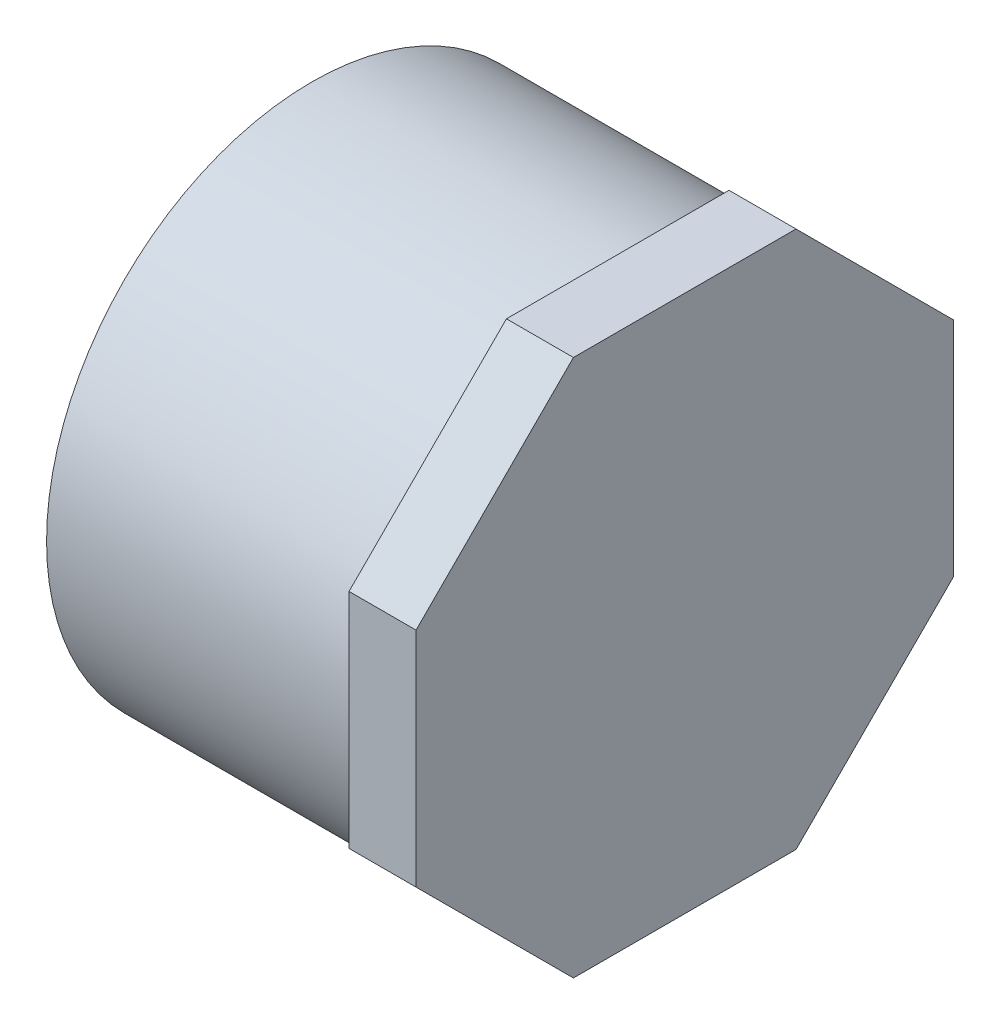
ISO-10303-21;
HEADER;
FILE_DESCRIPTION(('STEP AP214'),'2;1');
FILE_NAME('part.step','',(''),(''),'','','');
FILE_SCHEMA(('AUTOMOTIVE_DESIGN { 1 0 10303 214 1 1 1 1 }'));
ENDSEC;
DATA;
#1=APPLICATION_CONTEXT('core data for automotive mechanical design processes');
#2=APPLICATION_PROTOCOL_DEFINITION('international standard','automotive_design',2000,#1);
#3=PRODUCT_CONTEXT('',#1,'mechanical');
#4=PRODUCT('Part','Part','',(#3));
#5=PRODUCT_RELATED_PRODUCT_CATEGORY('part','',(#4));
#6=PRODUCT_DEFINITION_FORMATION('','',#4);
#7=PRODUCT_DEFINITION_CONTEXT('part definition',#1,'design');
#8=PRODUCT_DEFINITION('design','',#6,#7);
#9=PRODUCT_DEFINITION_SHAPE('','',#8);
#10=(LENGTH_UNIT() NAMED_UNIT(*) SI_UNIT(.MILLI.,.METRE.));
#11=(NAMED_UNIT(*) PLANE_ANGLE_UNIT() SI_UNIT($,.RADIAN.));
#12=(NAMED_UNIT(*) SI_UNIT($,.STERADIAN.) SOLID_ANGLE_UNIT());
#13=UNCERTAINTY_MEASURE_WITH_UNIT(LENGTH_MEASURE(1.E-05),#10,'distance_accuracy_value','');
#14=(GEOMETRIC_REPRESENTATION_CONTEXT(3) GLOBAL_UNCERTAINTY_ASSIGNED_CONTEXT((#13)) GLOBAL_UNIT_ASSIGNED_CONTEXT((#10,
#11,#12)) REPRESENTATION_CONTEXT('',''));
#15=CARTESIAN_POINT('',(0.,0.,0.));
#16=DIRECTION('',(0.,0.,1.));
#17=DIRECTION('',(1.,0.,0.));
#18=AXIS2_PLACEMENT_3D('',#15,#16,#17);
#19=CARTESIAN_POINT('',(-4.75811910626383,0.,0.));
#20=DIRECTION('',(-1.,0.,0.));
#21=DIRECTION('',(0.,0.,1.));
#22=AXIS2_PLACEMENT_3D('',#19,#20,#21);
#23=CYLINDRICAL_SURFACE('',#22,12.366625);
#24=CARTESIAN_POINT('',(-4.75811910626383,0.,0.));
#25=DIRECTION('',(-1.,0.,0.));
#26=DIRECTION('',(0.,0.,1.));
#27=AXIS2_PLACEMENT_3D('',#24,#25,#26);
#28=CIRCLE('',#27,12.366625);
#29=CARTESIAN_POINT('',(-4.75811910626383,0.,12.366625));
#30=VERTEX_POINT('',#29);
#31=EDGE_CURVE('E11',#30,#30,#28,.T.);
#32=ORIENTED_EDGE('',*,*,#31,.F.);
#33=EDGE_LOOP('',(#32));
#34=FACE_BOUND('',#33,.T.);
#35=CARTESIAN_POINT('',(9.50906089373617,0.,0.));
#36=DIRECTION('',(1.,0.,0.));
#37=DIRECTION('',(0.,0.,-1.));
#38=AXIS2_PLACEMENT_3D('',#35,#36,#37);
#39=CIRCLE('',#38,12.366625);
#40=CARTESIAN_POINT('',(9.50906089373617,0.,-12.366625));
#41=VERTEX_POINT('',#40);
#42=EDGE_CURVE('E138',#41,#41,#39,.T.);
#43=ORIENTED_EDGE('',*,*,#42,.F.);
#44=EDGE_LOOP('',(#43));
#45=FACE_BOUND('',#44,.T.);
#46=ADVANCED_FACE('F34',(#34,#45),#23,.T.);
#47=CARTESIAN_POINT('',(-4.75811910626383,-10.762869,0.));
#48=DIRECTION('',(-1.,0.,0.));
#49=DIRECTION('',(0.,0.,1.));
#50=AXIS2_PLACEMENT_3D('',#47,#48,#49);
#51=PLANE('',#50);
#52=ORIENTED_EDGE('',*,*,#31,.T.);
#53=EDGE_LOOP('',(#52));
#54=FACE_BOUND('',#53,.T.);
#55=CARTESIAN_POINT('',(-4.75811910626383,0.,0.));
#56=DIRECTION('',(-1.,0.,0.));
#57=DIRECTION('',(0.,0.,1.));
#58=AXIS2_PLACEMENT_3D('',#55,#56,#57);
#59=CIRCLE('',#58,10.762869);
#60=CARTESIAN_POINT('',(-4.75811910626383,0.,10.762869));
#61=VERTEX_POINT('',#60);
#62=EDGE_CURVE('E158',#61,#61,#59,.T.);
#63=ORIENTED_EDGE('',*,*,#62,.F.);
#64=EDGE_LOOP('',(#63));
#65=FACE_BOUND('',#64,.T.);
#66=ADVANCED_FACE('F36',(#54,#65),#51,.T.);
#67=CARTESIAN_POINT('',(9.50906089373617,0.,0.));
#68=DIRECTION('',(-1.,0.,0.));
#69=DIRECTION('',(0.,0.,1.));
#70=AXIS2_PLACEMENT_3D('',#67,#68,#69);
#71=PLANE('',#70);
#72=CARTESIAN_POINT('',(9.50906089373617,0.,0.));
#73=DIRECTION('',(-1.,0.,0.));
#74=DIRECTION('',(0.,0.,1.));
#75=AXIS2_PLACEMENT_3D('',#72,#73,#74);
#76=CIRCLE('',#75,10.762869);
#77=CARTESIAN_POINT('',(9.50906089373617,0.,10.762869));
#78=VERTEX_POINT('',#77);
#79=EDGE_CURVE('E43',#78,#78,#76,.T.);
#80=ORIENTED_EDGE('',*,*,#79,.T.);
#81=EDGE_LOOP('',(#80));
#82=FACE_BOUND('',#81,.T.);
#83=ADVANCED_FACE('F172',(#82),#71,.T.);
#84=CARTESIAN_POINT('',(-4.75811910626383,0.,0.));
#85=DIRECTION('',(-1.,0.,0.));
#86=DIRECTION('',(0.,0.,1.));
#87=AXIS2_PLACEMENT_3D('',#84,#85,#86);
#88=CYLINDRICAL_SURFACE('',#87,10.762869);
#89=ORIENTED_EDGE('',*,*,#62,.T.);
#90=EDGE_LOOP('',(#89));
#91=FACE_BOUND('',#90,.T.);
#92=ORIENTED_EDGE('',*,*,#79,.F.);
#93=EDGE_LOOP('',(#92));
#94=FACE_BOUND('',#93,.T.);
#95=ADVANCED_FACE('F174',(#91,#94),#88,.F.);
#96=CARTESIAN_POINT('',(9.50906089373617,12.52934375,-5.18982410888457));
#97=DIRECTION('',(0.,1.,0.));
#98=DIRECTION('',(0.,0.,1.));
#99=AXIS2_PLACEMENT_3D('',#96,#97,#98);
#100=PLANE('',#99);
#101=DIRECTION('',(0.,0.,1.));
#102=VECTOR('',#101,1.);
#103=CARTESIAN_POINT('',(12.6332608937362,12.52934375,-5.18982410888457));
#104=LINE('',#103,#102);
#105=CARTESIAN_POINT('',(12.6332608937362,12.52934375,-5.18982410888457));
#106=VERTEX_POINT('',#105);
#107=CARTESIAN_POINT('',(12.6332608937362,12.52934375,5.18982410888458));
#108=VERTEX_POINT('',#107);
#109=EDGE_CURVE('E134',#106,#108,#104,.T.);
#110=ORIENTED_EDGE('',*,*,#109,.F.);
#111=DIRECTION('',(1.,0.,0.));
#112=VECTOR('',#111,1.);
#113=CARTESIAN_POINT('',(9.50906089373617,12.52934375,-5.18982410888457));
#114=LINE('',#113,#112);
#115=CARTESIAN_POINT('',(9.50906089373617,12.52934375,-5.18982410888457));
#116=VERTEX_POINT('',#115);
#117=EDGE_CURVE('E51',#116,#106,#114,.T.);
#118=ORIENTED_EDGE('',*,*,#117,.F.);
#119=DIRECTION('',(0.,0.,1.));
#120=VECTOR('',#119,1.);
#121=CARTESIAN_POINT('',(9.50906089373617,12.52934375,-5.18982410888457));
#122=LINE('',#121,#120);
#123=CARTESIAN_POINT('',(9.50906089373617,12.52934375,5.18982410888458));
#124=VERTEX_POINT('',#123);
#125=EDGE_CURVE('E156',#116,#124,#122,.T.);
#126=ORIENTED_EDGE('',*,*,#125,.T.);
#127=DIRECTION('',(1.,0.,0.));
#128=VECTOR('',#127,1.);
#129=CARTESIAN_POINT('',(9.50906089373617,12.52934375,5.18982410888458));
#130=LINE('',#129,#128);
#131=EDGE_CURVE('E92',#124,#108,#130,.T.);
#132=ORIENTED_EDGE('',*,*,#131,.T.);
#133=EDGE_LOOP('',(#110,#118,#126,#132));
#134=FACE_BOUND('',#133,.T.);
#135=ADVANCED_FACE('F176',(#134),#100,.T.);
#136=CARTESIAN_POINT('',(9.50906089373617,5.18982410888458,-12.52934375));
#137=DIRECTION('',(0.,0.707106781186548,-0.707106781186547));
#138=DIRECTION('',(0.,0.707106781186547,0.707106781186548));
#139=AXIS2_PLACEMENT_3D('',#136,#137,#138);
#140=PLANE('',#139);
#141=DIRECTION('',(0.,0.707106781186547,0.707106781186548));
#142=VECTOR('',#141,1.);
#143=CARTESIAN_POINT('',(12.6332608937362,5.18982410888458,-12.52934375));
#144=LINE('',#143,#142);
#145=CARTESIAN_POINT('',(12.6332608937362,5.18982410888458,-12.52934375));
#146=VERTEX_POINT('',#145);
#147=EDGE_CURVE('E153',#146,#106,#144,.T.);
#148=ORIENTED_EDGE('',*,*,#147,.F.);
#149=DIRECTION('',(1.,0.,0.));
#150=VECTOR('',#149,1.);
#151=CARTESIAN_POINT('',(9.50906089373617,5.18982410888458,-12.52934375));
#152=LINE('',#151,#150);
#153=CARTESIAN_POINT('',(9.50906089373617,5.18982410888458,-12.52934375));
#154=VERTEX_POINT('',#153);
#155=EDGE_CURVE('E80',#154,#146,#152,.T.);
#156=ORIENTED_EDGE('',*,*,#155,.F.);
#157=DIRECTION('',(0.,0.707106781186547,0.707106781186548));
#158=VECTOR('',#157,1.);
#159=CARTESIAN_POINT('',(9.50906089373617,5.18982410888458,-12.52934375));
#160=LINE('',#159,#158);
#161=EDGE_CURVE('E124',#154,#116,#160,.T.);
#162=ORIENTED_EDGE('',*,*,#161,.T.);
#163=ORIENTED_EDGE('',*,*,#117,.T.);
#164=EDGE_LOOP('',(#148,#156,#162,#163));
#165=FACE_BOUND('',#164,.T.);
#166=ADVANCED_FACE('F183',(#165),#140,.T.);
#167=CARTESIAN_POINT('',(9.50906089373617,-5.18982410888457,-12.52934375));
#168=DIRECTION('',(0.,0.,-1.));
#169=DIRECTION('',(-1.,0.,0.));
#170=AXIS2_PLACEMENT_3D('',#167,#168,#169);
#171=PLANE('',#170);
#172=DIRECTION('',(0.,1.,0.));
#173=VECTOR('',#172,1.);
#174=CARTESIAN_POINT('',(12.6332608937362,-5.18982410888457,-12.52934375));
#175=LINE('',#174,#173);
#176=CARTESIAN_POINT('',(12.6332608937362,-5.18982410888457,-12.52934375));
#177=VERTEX_POINT('',#176);
#178=EDGE_CURVE('E111',#177,#146,#175,.T.);
#179=ORIENTED_EDGE('',*,*,#178,.F.);
#180=DIRECTION('',(1.,0.,0.));
#181=VECTOR('',#180,1.);
#182=CARTESIAN_POINT('',(9.50906089373617,-5.18982410888457,-12.52934375));
#183=LINE('',#182,#181);
#184=CARTESIAN_POINT('',(9.50906089373617,-5.18982410888457,-12.52934375));
#185=VERTEX_POINT('',#184);
#186=EDGE_CURVE('E106',#185,#177,#183,.T.);
#187=ORIENTED_EDGE('',*,*,#186,.F.);
#188=DIRECTION('',(0.,1.,0.));
#189=VECTOR('',#188,1.);
#190=CARTESIAN_POINT('',(9.50906089373617,-5.18982410888457,-12.52934375));
#191=LINE('',#190,#189);
#192=EDGE_CURVE('E109',#185,#154,#191,.T.);
#193=ORIENTED_EDGE('',*,*,#192,.T.);
#194=ORIENTED_EDGE('',*,*,#155,.T.);
#195=EDGE_LOOP('',(#179,#187,#193,#194));
#196=FACE_BOUND('',#195,.T.);
#197=ADVANCED_FACE('F108',(#196),#171,.T.);
#198=CARTESIAN_POINT('',(9.50906089373617,-12.52934375,-5.18982410888458));
#199=DIRECTION('',(0.,-0.707106781186547,-0.707106781186548));
#200=DIRECTION('',(0.,0.707106781186548,-0.707106781186547));
#201=AXIS2_PLACEMENT_3D('',#198,#199,#200);
#202=PLANE('',#201);
#203=DIRECTION('',(0.,0.707106781186548,-0.707106781186547));
#204=VECTOR('',#203,1.);
#205=CARTESIAN_POINT('',(12.6332608937362,-12.52934375,-5.18982410888458));
#206=LINE('',#205,#204);
#207=CARTESIAN_POINT('',(12.6332608937362,-12.52934375,-5.18982410888458));
#208=VERTEX_POINT('',#207);
#209=EDGE_CURVE('E150',#208,#177,#206,.T.);
#210=ORIENTED_EDGE('',*,*,#209,.F.);
#211=DIRECTION('',(1.,0.,0.));
#212=VECTOR('',#211,1.);
#213=CARTESIAN_POINT('',(9.50906089373617,-12.52934375,-5.18982410888458));
#214=LINE('',#213,#212);
#215=CARTESIAN_POINT('',(9.50906089373617,-12.52934375,-5.18982410888458));
#216=VERTEX_POINT('',#215);
#217=EDGE_CURVE('E116',#216,#208,#214,.T.);
#218=ORIENTED_EDGE('',*,*,#217,.F.);
#219=DIRECTION('',(0.,0.707106781186548,-0.707106781186547));
#220=VECTOR('',#219,1.);
#221=CARTESIAN_POINT('',(9.50906089373617,-12.52934375,-5.18982410888458));
#222=LINE('',#221,#220);
#223=EDGE_CURVE('E122',#216,#185,#222,.T.);
#224=ORIENTED_EDGE('',*,*,#223,.T.);
#225=ORIENTED_EDGE('',*,*,#186,.T.);
#226=EDGE_LOOP('',(#210,#218,#224,#225));
#227=FACE_BOUND('',#226,.T.);
#228=ADVANCED_FACE('F126',(#227),#202,.T.);
#229=CARTESIAN_POINT('',(9.50906089373617,-12.52934375,5.18982410888457));
#230=DIRECTION('',(0.,-1.,0.));
#231=DIRECTION('',(0.,0.,-1.));
#232=AXIS2_PLACEMENT_3D('',#229,#230,#231);
#233=PLANE('',#232);
#234=DIRECTION('',(0.,0.,-1.));
#235=VECTOR('',#234,1.);
#236=CARTESIAN_POINT('',(12.6332608937362,-12.52934375,5.18982410888457));
#237=LINE('',#236,#235);
#238=CARTESIAN_POINT('',(12.6332608937362,-12.52934375,5.18982410888457));
#239=VERTEX_POINT('',#238);
#240=EDGE_CURVE('E147',#239,#208,#237,.T.);
#241=ORIENTED_EDGE('',*,*,#240,.F.);
#242=DIRECTION('',(1.,0.,0.));
#243=VECTOR('',#242,1.);
#244=CARTESIAN_POINT('',(9.50906089373617,-12.52934375,5.18982410888457));
#245=LINE('',#244,#243);
#246=CARTESIAN_POINT('',(9.50906089373617,-12.52934375,5.18982410888457));
#247=VERTEX_POINT('',#246);
#248=EDGE_CURVE('E161',#247,#239,#245,.T.);
#249=ORIENTED_EDGE('',*,*,#248,.F.);
#250=DIRECTION('',(0.,0.,-1.));
#251=VECTOR('',#250,1.);
#252=CARTESIAN_POINT('',(9.50906089373617,-12.52934375,5.18982410888457));
#253=LINE('',#252,#251);
#254=EDGE_CURVE('E127',#247,#216,#253,.T.);
#255=ORIENTED_EDGE('',*,*,#254,.T.);
#256=ORIENTED_EDGE('',*,*,#217,.T.);
#257=EDGE_LOOP('',(#241,#249,#255,#256));
#258=FACE_BOUND('',#257,.T.);
#259=ADVANCED_FACE('F217',(#258),#233,.T.);
#260=CARTESIAN_POINT('',(9.50906089373617,-5.18982410888457,12.52934375));
#261=DIRECTION('',(0.,-0.707106781186548,0.707106781186547));
#262=DIRECTION('',(0.,-0.707106781186547,-0.707106781186548));
#263=AXIS2_PLACEMENT_3D('',#260,#261,#262);
#264=PLANE('',#263);
#265=DIRECTION('',(0.,-0.707106781186547,-0.707106781186548));
#266=VECTOR('',#265,1.);
#267=CARTESIAN_POINT('',(12.6332608937362,-5.18982410888457,12.52934375));
#268=LINE('',#267,#266);
#269=CARTESIAN_POINT('',(12.6332608937362,-5.18982410888457,12.52934375));
#270=VERTEX_POINT('',#269);
#271=EDGE_CURVE('E144',#270,#239,#268,.T.);
#272=ORIENTED_EDGE('',*,*,#271,.F.);
#273=DIRECTION('',(1.,0.,0.));
#274=VECTOR('',#273,1.);
#275=CARTESIAN_POINT('',(9.50906089373617,-5.18982410888457,12.52934375));
#276=LINE('',#275,#274);
#277=CARTESIAN_POINT('',(9.50906089373617,-5.18982410888457,12.52934375));
#278=VERTEX_POINT('',#277);
#279=EDGE_CURVE('E163',#278,#270,#276,.T.);
#280=ORIENTED_EDGE('',*,*,#279,.F.);
#281=DIRECTION('',(0.,-0.707106781186547,-0.707106781186548));
#282=VECTOR('',#281,1.);
#283=CARTESIAN_POINT('',(9.50906089373617,-5.18982410888457,12.52934375));
#284=LINE('',#283,#282);
#285=EDGE_CURVE('E129',#278,#247,#284,.T.);
#286=ORIENTED_EDGE('',*,*,#285,.T.);
#287=ORIENTED_EDGE('',*,*,#248,.T.);
#288=EDGE_LOOP('',(#272,#280,#286,#287));
#289=FACE_BOUND('',#288,.T.);
#290=ADVANCED_FACE('F213',(#289),#264,.T.);
#291=CARTESIAN_POINT('',(9.50906089373617,5.18982410888457,12.52934375));
#292=DIRECTION('',(0.,0.,1.));
#293=DIRECTION('',(0.,-1.,0.));
#294=AXIS2_PLACEMENT_3D('',#291,#292,#293);
#295=PLANE('',#294);
#296=DIRECTION('',(0.,-1.,0.));
#297=VECTOR('',#296,1.);
#298=CARTESIAN_POINT('',(12.6332608937362,5.18982410888457,12.52934375));
#299=LINE('',#298,#297);
#300=CARTESIAN_POINT('',(12.6332608937362,5.18982410888457,12.52934375));
#301=VERTEX_POINT('',#300);
#302=EDGE_CURVE('E141',#301,#270,#299,.T.);
#303=ORIENTED_EDGE('',*,*,#302,.F.);
#304=DIRECTION('',(1.,0.,0.));
#305=VECTOR('',#304,1.);
#306=CARTESIAN_POINT('',(9.50906089373617,5.18982410888457,12.52934375));
#307=LINE('',#306,#305);
#308=CARTESIAN_POINT('',(9.50906089373617,5.18982410888457,12.52934375));
#309=VERTEX_POINT('',#308);
#310=EDGE_CURVE('E165',#309,#301,#307,.T.);
#311=ORIENTED_EDGE('',*,*,#310,.F.);
#312=DIRECTION('',(0.,-1.,0.));
#313=VECTOR('',#312,1.);
#314=CARTESIAN_POINT('',(9.50906089373617,5.18982410888457,12.52934375));
#315=LINE('',#314,#313);
#316=EDGE_CURVE('E313',#309,#278,#315,.T.);
#317=ORIENTED_EDGE('',*,*,#316,.T.);
#318=ORIENTED_EDGE('',*,*,#279,.T.);
#319=EDGE_LOOP('',(#303,#311,#317,#318));
#320=FACE_BOUND('',#319,.T.);
#321=ADVANCED_FACE('F209',(#320),#295,.T.);
#322=CARTESIAN_POINT('',(9.50906089373617,12.52934375,5.18982410888458));
#323=DIRECTION('',(0.,0.707106781186547,0.707106781186548));
#324=DIRECTION('',(0.,-0.707106781186548,0.707106781186547));
#325=AXIS2_PLACEMENT_3D('',#322,#323,#324);
#326=PLANE('',#325);
#327=DIRECTION('',(0.,-0.707106781186548,0.707106781186547));
#328=VECTOR('',#327,1.);
#329=CARTESIAN_POINT('',(12.6332608937362,12.52934375,5.18982410888458));
#330=LINE('',#329,#328);
#331=EDGE_CURVE('E137',#108,#301,#330,.T.);
#332=ORIENTED_EDGE('',*,*,#331,.F.);
#333=ORIENTED_EDGE('',*,*,#131,.F.);
#334=DIRECTION('',(0.,-0.707106781186548,0.707106781186547));
#335=VECTOR('',#334,1.);
#336=CARTESIAN_POINT('',(9.50906089373617,12.52934375,5.18982410888458));
#337=LINE('',#336,#335);
#338=EDGE_CURVE('E205',#124,#309,#337,.T.);
#339=ORIENTED_EDGE('',*,*,#338,.T.);
#340=ORIENTED_EDGE('',*,*,#310,.T.);
#341=EDGE_LOOP('',(#332,#333,#339,#340));
#342=FACE_BOUND('',#341,.T.);
#343=ADVANCED_FACE('F201',(#342),#326,.T.);
#344=CARTESIAN_POINT('',(9.50906089373617,12.52934375,12.52934375));
#345=DIRECTION('',(1.,0.,0.));
#346=DIRECTION('',(0.,0.,-1.));
#347=AXIS2_PLACEMENT_3D('',#344,#345,#346);
#348=PLANE('',#347);
#349=ORIENTED_EDGE('',*,*,#42,.T.);
#350=EDGE_LOOP('',(#349));
#351=FACE_BOUND('',#350,.T.);
#352=ORIENTED_EDGE('',*,*,#125,.F.);
#353=ORIENTED_EDGE('',*,*,#161,.F.);
#354=ORIENTED_EDGE('',*,*,#192,.F.);
#355=ORIENTED_EDGE('',*,*,#223,.F.);
#356=ORIENTED_EDGE('',*,*,#254,.F.);
#357=ORIENTED_EDGE('',*,*,#285,.F.);
#358=ORIENTED_EDGE('',*,*,#316,.F.);
#359=ORIENTED_EDGE('',*,*,#338,.F.);
#360=EDGE_LOOP('',(#352,#353,#354,#355,#356,#357,#358,#359));
#361=FACE_BOUND('',#360,.T.);
#362=ADVANCED_FACE('F120',(#351,#361),#348,.F.);
#363=CARTESIAN_POINT('',(12.6332608937362,0.,0.));
#364=DIRECTION('',(1.,0.,0.));
#365=DIRECTION('',(0.,0.,-1.));
#366=AXIS2_PLACEMENT_3D('',#363,#364,#365);
#367=PLANE('',#366);
#368=ORIENTED_EDGE('',*,*,#109,.T.);
#369=ORIENTED_EDGE('',*,*,#331,.T.);
#370=ORIENTED_EDGE('',*,*,#302,.T.);
#371=ORIENTED_EDGE('',*,*,#271,.T.);
#372=ORIENTED_EDGE('',*,*,#240,.T.);
#373=ORIENTED_EDGE('',*,*,#209,.T.);
#374=ORIENTED_EDGE('',*,*,#178,.T.);
#375=ORIENTED_EDGE('',*,*,#147,.T.);
#376=EDGE_LOOP('',(#368,#369,#370,#371,#372,#373,#374,#375));
#377=FACE_BOUND('',#376,.T.);
#378=ADVANCED_FACE('F195',(#377),#367,.T.);
#379=CLOSED_SHELL('',(#46,#66,#83,#95,#135,#166,#197,#228,#259,#290,#321,#343,#362,#378));
#380=MANIFOLD_SOLID_BREP('B2',#379);
#381=ADVANCED_BREP_SHAPE_REPRESENTATION('',(#18,#380),#14);
#382=SHAPE_DEFINITION_REPRESENTATION(#9,#381);
ENDSEC;
END-ISO-10303-21;
